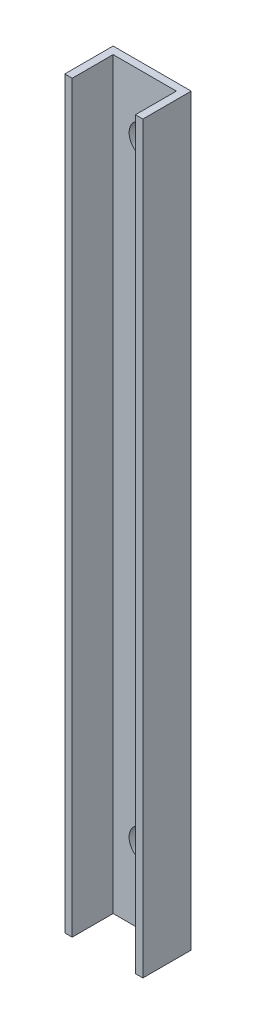
ISO-10303-21;
HEADER;
FILE_DESCRIPTION(('STEP AP214'),'2;1');
FILE_NAME('part.step','',(''),(''),'','','');
FILE_SCHEMA(('AUTOMOTIVE_DESIGN { 1 0 10303 214 1 1 1 1 }'));
ENDSEC;
DATA;
#1=APPLICATION_CONTEXT('core data for automotive mechanical design processes');
#2=APPLICATION_PROTOCOL_DEFINITION('international standard','automotive_design',2000,#1);
#3=PRODUCT_CONTEXT('',#1,'mechanical');
#4=PRODUCT('Part','Part','',(#3));
#5=PRODUCT_RELATED_PRODUCT_CATEGORY('part','',(#4));
#6=PRODUCT_DEFINITION_FORMATION('','',#4);
#7=PRODUCT_DEFINITION_CONTEXT('part definition',#1,'design');
#8=PRODUCT_DEFINITION('design','',#6,#7);
#9=PRODUCT_DEFINITION_SHAPE('','',#8);
#10=(LENGTH_UNIT() NAMED_UNIT(*) SI_UNIT(.MILLI.,.METRE.));
#11=(NAMED_UNIT(*) PLANE_ANGLE_UNIT() SI_UNIT($,.RADIAN.));
#12=(NAMED_UNIT(*) SI_UNIT($,.STERADIAN.) SOLID_ANGLE_UNIT());
#13=UNCERTAINTY_MEASURE_WITH_UNIT(LENGTH_MEASURE(1.E-05),#10,'distance_accuracy_value','');
#14=(GEOMETRIC_REPRESENTATION_CONTEXT(3) GLOBAL_UNCERTAINTY_ASSIGNED_CONTEXT((#13)) GLOBAL_UNIT_ASSIGNED_CONTEXT((#10,
#11,#12)) REPRESENTATION_CONTEXT('',''));
#15=CARTESIAN_POINT('',(0.,0.,0.));
#16=DIRECTION('',(0.,0.,1.));
#17=DIRECTION('',(1.,0.,0.));
#18=AXIS2_PLACEMENT_3D('',#15,#16,#17);
#19=CARTESIAN_POINT('',(6.03004291845494,100.,-4.68669527896996));
#20=DIRECTION('',(1.,0.,0.));
#21=DIRECTION('',(0.,0.,-1.));
#22=AXIS2_PLACEMENT_3D('',#19,#20,#21);
#23=PLANE('',#22);
#24=DIRECTION('',(0.,0.,1.));
#25=VECTOR('',#24,1.);
#26=CARTESIAN_POINT('',(6.03004291845494,0.,-4.68669527896996));
#27=LINE('',#26,#25);
#28=CARTESIAN_POINT('',(6.03004291845494,0.,-3.68669527896996));
#29=VERTEX_POINT('',#28);
#30=CARTESIAN_POINT('',(6.03004291845494,0.,1.81330472103004));
#31=VERTEX_POINT('',#30);
#32=EDGE_CURVE('E131',#29,#31,#27,.T.);
#33=ORIENTED_EDGE('',*,*,#32,.T.);
#34=DIRECTION('',(0.,-1.,0.));
#35=VECTOR('',#34,1.);
#36=CARTESIAN_POINT('',(6.03004291845494,100.,1.81330472103004));
#37=LINE('',#36,#35);
#38=CARTESIAN_POINT('',(6.03004291845494,100.,1.81330472103004));
#39=VERTEX_POINT('',#38);
#40=EDGE_CURVE('E11',#39,#31,#37,.T.);
#41=ORIENTED_EDGE('',*,*,#40,.F.);
#42=DIRECTION('',(0.,0.,1.));
#43=VECTOR('',#42,1.);
#44=CARTESIAN_POINT('',(6.03004291845494,100.,-4.68669527896996));
#45=LINE('',#44,#43);
#46=CARTESIAN_POINT('',(6.03004291845494,100.,-3.68669527896996));
#47=VERTEX_POINT('',#46);
#48=EDGE_CURVE('E89',#47,#39,#45,.T.);
#49=ORIENTED_EDGE('',*,*,#48,.F.);
#50=DIRECTION('',(0.,-1.,0.));
#51=VECTOR('',#50,1.);
#52=CARTESIAN_POINT('',(6.03004291845494,100.,-3.68669527896996));
#53=LINE('',#52,#51);
#54=EDGE_CURVE('E130',#47,#29,#53,.T.);
#55=ORIENTED_EDGE('',*,*,#54,.T.);
#56=EDGE_LOOP('',(#33,#41,#49,#55));
#57=FACE_BOUND('',#56,.T.);
#58=ADVANCED_FACE('F32',(#57),#23,.F.);
#59=CARTESIAN_POINT('',(7.03004291845494,100.,1.81330472103004));
#60=DIRECTION('',(0.,0.,1.));
#61=DIRECTION('',(1.,0.,0.));
#62=AXIS2_PLACEMENT_3D('',#59,#60,#61);
#63=PLANE('',#62);
#64=DIRECTION('',(-1.,0.,0.));
#65=VECTOR('',#64,1.);
#66=CARTESIAN_POINT('',(7.03004291845494,0.,1.81330472103004));
#67=LINE('',#66,#65);
#68=CARTESIAN_POINT('',(7.03004291845494,0.,1.81330472103004));
#69=VERTEX_POINT('',#68);
#70=EDGE_CURVE('E134',#69,#31,#67,.T.);
#71=ORIENTED_EDGE('',*,*,#70,.F.);
#72=DIRECTION('',(0.,-1.,0.));
#73=VECTOR('',#72,1.);
#74=CARTESIAN_POINT('',(7.03004291845494,100.,1.81330472103004));
#75=LINE('',#74,#73);
#76=CARTESIAN_POINT('',(7.03004291845494,100.,1.81330472103004));
#77=VERTEX_POINT('',#76);
#78=EDGE_CURVE('E41',#77,#69,#75,.T.);
#79=ORIENTED_EDGE('',*,*,#78,.F.);
#80=DIRECTION('',(-1.,0.,0.));
#81=VECTOR('',#80,1.);
#82=CARTESIAN_POINT('',(7.03004291845494,100.,1.81330472103004));
#83=LINE('',#82,#81);
#84=EDGE_CURVE('E170',#77,#39,#83,.T.);
#85=ORIENTED_EDGE('',*,*,#84,.T.);
#86=ORIENTED_EDGE('',*,*,#40,.T.);
#87=EDGE_LOOP('',(#71,#79,#85,#86));
#88=FACE_BOUND('',#87,.T.);
#89=ADVANCED_FACE('F203',(#88),#63,.T.);
#90=CARTESIAN_POINT('',(7.03004291845494,100.,-4.68669527896996));
#91=DIRECTION('',(1.,0.,0.));
#92=DIRECTION('',(0.,0.,-1.));
#93=AXIS2_PLACEMENT_3D('',#90,#91,#92);
#94=PLANE('',#93);
#95=DIRECTION('',(0.,0.,1.));
#96=VECTOR('',#95,1.);
#97=CARTESIAN_POINT('',(7.03004291845494,0.,-4.68669527896996));
#98=LINE('',#97,#96);
#99=CARTESIAN_POINT('',(7.03004291845494,0.,-4.68669527896996));
#100=VERTEX_POINT('',#99);
#101=EDGE_CURVE('E138',#100,#69,#98,.T.);
#102=ORIENTED_EDGE('',*,*,#101,.F.);
#103=DIRECTION('',(0.,-1.,0.));
#104=VECTOR('',#103,1.);
#105=CARTESIAN_POINT('',(7.03004291845494,100.,-4.68669527896996));
#106=LINE('',#105,#104);
#107=CARTESIAN_POINT('',(7.03004291845494,100.,-4.68669527896996));
#108=VERTEX_POINT('',#107);
#109=EDGE_CURVE('E155',#108,#100,#106,.T.);
#110=ORIENTED_EDGE('',*,*,#109,.F.);
#111=DIRECTION('',(0.,0.,1.));
#112=VECTOR('',#111,1.);
#113=CARTESIAN_POINT('',(7.03004291845494,100.,-4.68669527896996));
#114=LINE('',#113,#112);
#115=EDGE_CURVE('E173',#108,#77,#114,.T.);
#116=ORIENTED_EDGE('',*,*,#115,.T.);
#117=ORIENTED_EDGE('',*,*,#78,.T.);
#118=EDGE_LOOP('',(#102,#110,#116,#117));
#119=FACE_BOUND('',#118,.T.);
#120=ADVANCED_FACE('F207',(#119),#94,.T.);
#121=CARTESIAN_POINT('',(-3.46995708154506,100.,-4.68669527896996));
#122=DIRECTION('',(0.,0.,-1.));
#123=DIRECTION('',(-1.,0.,0.));
#124=AXIS2_PLACEMENT_3D('',#121,#122,#123);
#125=PLANE('',#124);
#126=CARTESIAN_POINT('',(1.78004291845492,9.99999999999999,-4.68669527896996));
#127=DIRECTION('',(0.,0.,-1.));
#128=DIRECTION('',(-1.,0.,0.));
#129=AXIS2_PLACEMENT_3D('',#126,#127,#128);
#130=CIRCLE('',#129,2.1);
#131=CARTESIAN_POINT('',(-0.319957081545073,9.99999999999999,-4.68669527896996));
#132=VERTEX_POINT('',#131);
#133=EDGE_CURVE('E166',#132,#132,#130,.T.);
#134=ORIENTED_EDGE('',*,*,#133,.F.);
#135=EDGE_LOOP('',(#134));
#136=FACE_BOUND('',#135,.T.);
#137=CARTESIAN_POINT('',(1.78004291845492,92.,-4.68669527896996));
#138=DIRECTION('',(0.,0.,-1.));
#139=DIRECTION('',(-1.,0.,0.));
#140=AXIS2_PLACEMENT_3D('',#137,#138,#139);
#141=CIRCLE('',#140,2.10000000000001);
#142=CARTESIAN_POINT('',(-0.319957081545084,92.,-4.68669527896996));
#143=VERTEX_POINT('',#142);
#144=EDGE_CURVE('E158',#143,#143,#141,.T.);
#145=ORIENTED_EDGE('',*,*,#144,.F.);
#146=EDGE_LOOP('',(#145));
#147=FACE_BOUND('',#146,.T.);
#148=DIRECTION('',(1.,0.,0.));
#149=VECTOR('',#148,1.);
#150=CARTESIAN_POINT('',(-3.46995708154506,0.,-4.68669527896996));
#151=LINE('',#150,#149);
#152=CARTESIAN_POINT('',(-3.46995708154506,0.,-4.68669527896996));
#153=VERTEX_POINT('',#152);
#154=EDGE_CURVE('E141',#153,#100,#151,.T.);
#155=ORIENTED_EDGE('',*,*,#154,.F.);
#156=DIRECTION('',(0.,-1.,0.));
#157=VECTOR('',#156,1.);
#158=CARTESIAN_POINT('',(-3.46995708154506,100.,-4.68669527896996));
#159=LINE('',#158,#157);
#160=CARTESIAN_POINT('',(-3.46995708154506,100.,-4.68669527896996));
#161=VERTEX_POINT('',#160);
#162=EDGE_CURVE('E153',#161,#153,#159,.T.);
#163=ORIENTED_EDGE('',*,*,#162,.F.);
#164=DIRECTION('',(1.,0.,0.));
#165=VECTOR('',#164,1.);
#166=CARTESIAN_POINT('',(-3.46995708154506,100.,-4.68669527896996));
#167=LINE('',#166,#165);
#168=EDGE_CURVE('E125',#161,#108,#167,.T.);
#169=ORIENTED_EDGE('',*,*,#168,.T.);
#170=ORIENTED_EDGE('',*,*,#109,.T.);
#171=EDGE_LOOP('',(#155,#163,#169,#170));
#172=FACE_BOUND('',#171,.T.);
#173=ADVANCED_FACE('F178',(#136,#147,#172),#125,.T.);
#174=CARTESIAN_POINT('',(-3.46995708154506,100.,1.81330472103004));
#175=DIRECTION('',(-1.,0.,0.));
#176=DIRECTION('',(0.,0.,1.));
#177=AXIS2_PLACEMENT_3D('',#174,#175,#176);
#178=PLANE('',#177);
#179=DIRECTION('',(0.,0.,-1.));
#180=VECTOR('',#179,1.);
#181=CARTESIAN_POINT('',(-3.46995708154506,0.,1.81330472103004));
#182=LINE('',#181,#180);
#183=CARTESIAN_POINT('',(-3.46995708154506,0.,1.81330472103004));
#184=VERTEX_POINT('',#183);
#185=EDGE_CURVE('E144',#184,#153,#182,.T.);
#186=ORIENTED_EDGE('',*,*,#185,.F.);
#187=DIRECTION('',(0.,-1.,0.));
#188=VECTOR('',#187,1.);
#189=CARTESIAN_POINT('',(-3.46995708154506,100.,1.81330472103004));
#190=LINE('',#189,#188);
#191=CARTESIAN_POINT('',(-3.46995708154506,100.,1.81330472103004));
#192=VERTEX_POINT('',#191);
#193=EDGE_CURVE('E113',#192,#184,#190,.T.);
#194=ORIENTED_EDGE('',*,*,#193,.F.);
#195=DIRECTION('',(0.,0.,-1.));
#196=VECTOR('',#195,1.);
#197=CARTESIAN_POINT('',(-3.46995708154506,100.,1.81330472103004));
#198=LINE('',#197,#196);
#199=EDGE_CURVE('E123',#192,#161,#198,.T.);
#200=ORIENTED_EDGE('',*,*,#199,.T.);
#201=ORIENTED_EDGE('',*,*,#162,.T.);
#202=EDGE_LOOP('',(#186,#194,#200,#201));
#203=FACE_BOUND('',#202,.T.);
#204=ADVANCED_FACE('F183',(#203),#178,.T.);
#205=CARTESIAN_POINT('',(-2.46995708154506,100.,1.81330472103004));
#206=DIRECTION('',(0.,0.,1.));
#207=DIRECTION('',(1.,0.,0.));
#208=AXIS2_PLACEMENT_3D('',#205,#206,#207);
#209=PLANE('',#208);
#210=DIRECTION('',(-1.,0.,0.));
#211=VECTOR('',#210,1.);
#212=CARTESIAN_POINT('',(-2.46995708154506,0.,1.81330472103004));
#213=LINE('',#212,#211);
#214=CARTESIAN_POINT('',(-2.46995708154506,0.,1.81330472103004));
#215=VERTEX_POINT('',#214);
#216=EDGE_CURVE('E112',#215,#184,#213,.T.);
#217=ORIENTED_EDGE('',*,*,#216,.F.);
#218=DIRECTION('',(0.,-1.,0.));
#219=VECTOR('',#218,1.);
#220=CARTESIAN_POINT('',(-2.46995708154506,100.,1.81330472103004));
#221=LINE('',#220,#219);
#222=CARTESIAN_POINT('',(-2.46995708154506,100.,1.81330472103004));
#223=VERTEX_POINT('',#222);
#224=EDGE_CURVE('E106',#223,#215,#221,.T.);
#225=ORIENTED_EDGE('',*,*,#224,.F.);
#226=DIRECTION('',(-1.,0.,0.));
#227=VECTOR('',#226,1.);
#228=CARTESIAN_POINT('',(-2.46995708154506,100.,1.81330472103004));
#229=LINE('',#228,#227);
#230=EDGE_CURVE('E110',#223,#192,#229,.T.);
#231=ORIENTED_EDGE('',*,*,#230,.T.);
#232=ORIENTED_EDGE('',*,*,#193,.T.);
#233=EDGE_LOOP('',(#217,#225,#231,#232));
#234=FACE_BOUND('',#233,.T.);
#235=ADVANCED_FACE('F108',(#234),#209,.T.);
#236=CARTESIAN_POINT('',(-2.46995708154506,100.,1.81330472103004));
#237=DIRECTION('',(-1.,0.,0.));
#238=DIRECTION('',(0.,0.,1.));
#239=AXIS2_PLACEMENT_3D('',#236,#237,#238);
#240=PLANE('',#239);
#241=DIRECTION('',(0.,0.,-1.));
#242=VECTOR('',#241,1.);
#243=CARTESIAN_POINT('',(-2.46995708154506,0.,1.81330472103004));
#244=LINE('',#243,#242);
#245=CARTESIAN_POINT('',(-2.46995708154506,0.,-3.68669527896996));
#246=VERTEX_POINT('',#245);
#247=EDGE_CURVE('E77',#215,#246,#244,.T.);
#248=ORIENTED_EDGE('',*,*,#247,.T.);
#249=DIRECTION('',(0.,-1.,0.));
#250=VECTOR('',#249,1.);
#251=CARTESIAN_POINT('',(-2.46995708154506,100.,-3.68669527896996));
#252=LINE('',#251,#250);
#253=CARTESIAN_POINT('',(-2.46995708154506,100.,-3.68669527896996));
#254=VERTEX_POINT('',#253);
#255=EDGE_CURVE('E114',#254,#246,#252,.T.);
#256=ORIENTED_EDGE('',*,*,#255,.F.);
#257=DIRECTION('',(0.,0.,-1.));
#258=VECTOR('',#257,1.);
#259=CARTESIAN_POINT('',(-2.46995708154506,100.,1.81330472103004));
#260=LINE('',#259,#258);
#261=EDGE_CURVE('E116',#223,#254,#260,.T.);
#262=ORIENTED_EDGE('',*,*,#261,.F.);
#263=ORIENTED_EDGE('',*,*,#224,.T.);
#264=EDGE_LOOP('',(#248,#256,#262,#263));
#265=FACE_BOUND('',#264,.T.);
#266=ADVANCED_FACE('F117',(#265),#240,.F.);
#267=CARTESIAN_POINT('',(-3.46995708154506,100.,-3.68669527896996));
#268=DIRECTION('',(0.,0.,-1.));
#269=DIRECTION('',(-1.,0.,0.));
#270=AXIS2_PLACEMENT_3D('',#267,#268,#269);
#271=PLANE('',#270);
#272=CARTESIAN_POINT('',(1.78004291845492,9.99999999999999,-3.68669527896996));
#273=DIRECTION('',(0.,0.,-1.));
#274=DIRECTION('',(-1.,0.,0.));
#275=AXIS2_PLACEMENT_3D('',#272,#273,#274);
#276=CIRCLE('',#275,2.1);
#277=CARTESIAN_POINT('',(-0.319957081545073,9.99999999999999,-3.68669527896996));
#278=VERTEX_POINT('',#277);
#279=EDGE_CURVE('E35',#278,#278,#276,.T.);
#280=ORIENTED_EDGE('',*,*,#279,.T.);
#281=EDGE_LOOP('',(#280));
#282=FACE_BOUND('',#281,.T.);
#283=CARTESIAN_POINT('',(1.78004291845492,92.,-3.68669527896996));
#284=DIRECTION('',(0.,0.,-1.));
#285=DIRECTION('',(-1.,0.,0.));
#286=AXIS2_PLACEMENT_3D('',#283,#284,#285);
#287=CIRCLE('',#286,2.10000000000001);
#288=CARTESIAN_POINT('',(-0.319957081545084,92.,-3.68669527896996));
#289=VERTEX_POINT('',#288);
#290=EDGE_CURVE('E135',#289,#289,#287,.T.);
#291=ORIENTED_EDGE('',*,*,#290,.T.);
#292=EDGE_LOOP('',(#291));
#293=FACE_BOUND('',#292,.T.);
#294=DIRECTION('',(1.,0.,0.));
#295=VECTOR('',#294,1.);
#296=CARTESIAN_POINT('',(-3.46995708154506,0.,-3.68669527896996));
#297=LINE('',#296,#295);
#298=EDGE_CURVE('E83',#246,#29,#297,.T.);
#299=ORIENTED_EDGE('',*,*,#298,.T.);
#300=ORIENTED_EDGE('',*,*,#54,.F.);
#301=DIRECTION('',(1.,0.,0.));
#302=VECTOR('',#301,1.);
#303=CARTESIAN_POINT('',(-3.46995708154506,100.,-3.68669527896996));
#304=LINE('',#303,#302);
#305=EDGE_CURVE('E50',#254,#47,#304,.T.);
#306=ORIENTED_EDGE('',*,*,#305,.F.);
#307=ORIENTED_EDGE('',*,*,#255,.T.);
#308=EDGE_LOOP('',(#299,#300,#306,#307));
#309=FACE_BOUND('',#308,.T.);
#310=ADVANCED_FACE('F189',(#282,#293,#309),#271,.F.);
#311=CARTESIAN_POINT('',(0.,100.,0.));
#312=DIRECTION('',(0.,-1.,0.));
#313=DIRECTION('',(-1.,0.,0.));
#314=AXIS2_PLACEMENT_3D('',#311,#312,#313);
#315=PLANE('',#314);
#316=ORIENTED_EDGE('',*,*,#48,.T.);
#317=ORIENTED_EDGE('',*,*,#84,.F.);
#318=ORIENTED_EDGE('',*,*,#115,.F.);
#319=ORIENTED_EDGE('',*,*,#168,.F.);
#320=ORIENTED_EDGE('',*,*,#199,.F.);
#321=ORIENTED_EDGE('',*,*,#230,.F.);
#322=ORIENTED_EDGE('',*,*,#261,.T.);
#323=ORIENTED_EDGE('',*,*,#305,.T.);
#324=EDGE_LOOP('',(#316,#317,#318,#319,#320,#321,#322,#323));
#325=FACE_BOUND('',#324,.T.);
#326=ADVANCED_FACE('F120',(#325),#315,.F.);
#327=CARTESIAN_POINT('',(0.,0.,0.));
#328=DIRECTION('',(0.,-1.,0.));
#329=DIRECTION('',(-1.,0.,0.));
#330=AXIS2_PLACEMENT_3D('',#327,#328,#329);
#331=PLANE('',#330);
#332=ORIENTED_EDGE('',*,*,#32,.F.);
#333=ORIENTED_EDGE('',*,*,#298,.F.);
#334=ORIENTED_EDGE('',*,*,#247,.F.);
#335=ORIENTED_EDGE('',*,*,#216,.T.);
#336=ORIENTED_EDGE('',*,*,#185,.T.);
#337=ORIENTED_EDGE('',*,*,#154,.T.);
#338=ORIENTED_EDGE('',*,*,#101,.T.);
#339=ORIENTED_EDGE('',*,*,#70,.T.);
#340=EDGE_LOOP('',(#332,#333,#334,#335,#336,#337,#338,#339));
#341=FACE_BOUND('',#340,.T.);
#342=ADVANCED_FACE('F186',(#341),#331,.T.);
#343=CARTESIAN_POINT('',(1.78004291845492,92.,5.31330472103004));
#344=DIRECTION('',(0.,0.,-1.));
#345=DIRECTION('',(-1.,0.,0.));
#346=AXIS2_PLACEMENT_3D('',#343,#344,#345);
#347=CYLINDRICAL_SURFACE('',#346,2.10000000000001);
#348=ORIENTED_EDGE('',*,*,#144,.T.);
#349=EDGE_LOOP('',(#348));
#350=FACE_BOUND('',#349,.T.);
#351=ORIENTED_EDGE('',*,*,#290,.F.);
#352=EDGE_LOOP('',(#351));
#353=FACE_BOUND('',#352,.T.);
#354=ADVANCED_FACE('F243',(#350,#353),#347,.F.);
#355=CARTESIAN_POINT('',(1.78004291845492,9.99999999999999,5.31330472103004));
#356=DIRECTION('',(0.,0.,-1.));
#357=DIRECTION('',(-1.,0.,0.));
#358=AXIS2_PLACEMENT_3D('',#355,#356,#357);
#359=CYLINDRICAL_SURFACE('',#358,2.1);
#360=ORIENTED_EDGE('',*,*,#133,.T.);
#361=EDGE_LOOP('',(#360));
#362=FACE_BOUND('',#361,.T.);
#363=ORIENTED_EDGE('',*,*,#279,.F.);
#364=EDGE_LOOP('',(#363));
#365=FACE_BOUND('',#364,.T.);
#366=ADVANCED_FACE('F248',(#362,#365),#359,.F.);
#367=CLOSED_SHELL('',(#58,#89,#120,#173,#204,#235,#266,#310,#326,#342,#354,#366));
#368=MANIFOLD_SOLID_BREP('B2',#367);
#369=ADVANCED_BREP_SHAPE_REPRESENTATION('',(#18,#368),#14);
#370=SHAPE_DEFINITION_REPRESENTATION(#9,#369);
ENDSEC;
END-ISO-10303-21;
